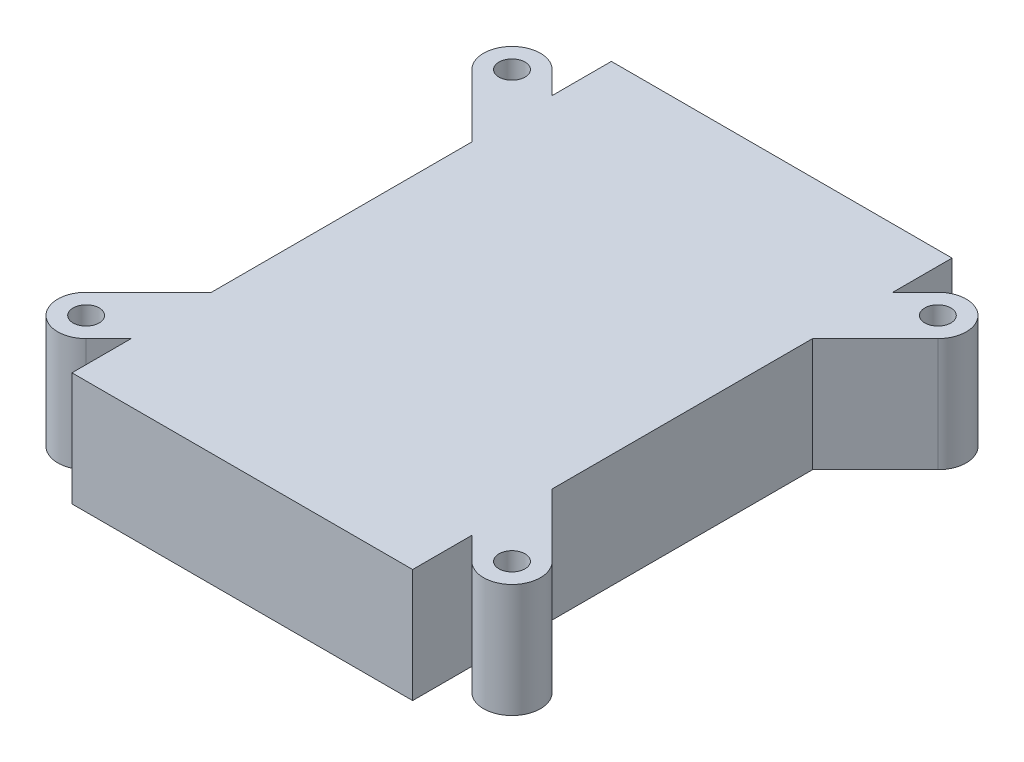
ISO-10303-21;
HEADER;
FILE_DESCRIPTION(('STEP AP214'),'2;1');
FILE_NAME('part.step','',(''),(''),'','','');
FILE_SCHEMA(('AUTOMOTIVE_DESIGN { 1 0 10303 214 1 1 1 1 }'));
ENDSEC;
DATA;
#1=APPLICATION_CONTEXT('core data for automotive mechanical design processes');
#2=APPLICATION_PROTOCOL_DEFINITION('international standard','automotive_design',2000,#1);
#3=PRODUCT_CONTEXT('',#1,'mechanical');
#4=PRODUCT('Part','Part','',(#3));
#5=PRODUCT_RELATED_PRODUCT_CATEGORY('part','',(#4));
#6=PRODUCT_DEFINITION_FORMATION('','',#4);
#7=PRODUCT_DEFINITION_CONTEXT('part definition',#1,'design');
#8=PRODUCT_DEFINITION('design','',#6,#7);
#9=PRODUCT_DEFINITION_SHAPE('','',#8);
#10=(LENGTH_UNIT() NAMED_UNIT(*) SI_UNIT(.MILLI.,.METRE.));
#11=(NAMED_UNIT(*) PLANE_ANGLE_UNIT() SI_UNIT($,.RADIAN.));
#12=(NAMED_UNIT(*) SI_UNIT($,.STERADIAN.) SOLID_ANGLE_UNIT());
#13=UNCERTAINTY_MEASURE_WITH_UNIT(LENGTH_MEASURE(1.E-05),#10,'distance_accuracy_value','');
#14=(GEOMETRIC_REPRESENTATION_CONTEXT(3) GLOBAL_UNCERTAINTY_ASSIGNED_CONTEXT((#13)) GLOBAL_UNIT_ASSIGNED_CONTEXT((#10,
#11,#12)) REPRESENTATION_CONTEXT('',''));
#15=CARTESIAN_POINT('',(0.,0.,0.));
#16=DIRECTION('',(0.,0.,1.));
#17=DIRECTION('',(1.,0.,0.));
#18=AXIS2_PLACEMENT_3D('',#15,#16,#17);
#19=CARTESIAN_POINT('',(37.5,20.,37.5));
#20=DIRECTION('',(0.,-1.,0.));
#21=DIRECTION('',(0.,0.,-1.));
#22=AXIS2_PLACEMENT_3D('',#19,#20,#21);
#23=CYLINDRICAL_SURFACE('',#22,5.);
#24=CARTESIAN_POINT('',(37.5,0.,37.5));
#25=DIRECTION('',(0.,1.,0.));
#26=DIRECTION('',(0.,0.,1.));
#27=AXIS2_PLACEMENT_3D('',#24,#25,#26);
#28=CIRCLE('',#27,5.);
#29=CARTESIAN_POINT('',(33.9644660940673,0.,41.0355339059327));
#30=VERTEX_POINT('',#29);
#31=CARTESIAN_POINT('',(41.0355339059327,0.,33.9644660940673));
#32=VERTEX_POINT('',#31);
#33=EDGE_CURVE('E295',#30,#32,#28,.T.);
#34=ORIENTED_EDGE('',*,*,#33,.T.);
#35=DIRECTION('',(0.,-1.,0.));
#36=VECTOR('',#35,1.);
#37=CARTESIAN_POINT('',(41.0355339059327,20.,33.9644660940673));
#38=LINE('',#37,#36);
#39=CARTESIAN_POINT('',(41.0355339059327,20.,33.9644660940673));
#40=VERTEX_POINT('',#39);
#41=EDGE_CURVE('E11',#40,#32,#38,.T.);
#42=ORIENTED_EDGE('',*,*,#41,.F.);
#43=CARTESIAN_POINT('',(37.5,20.,37.5));
#44=DIRECTION('',(0.,1.,0.));
#45=DIRECTION('',(0.,0.,1.));
#46=AXIS2_PLACEMENT_3D('',#43,#44,#45);
#47=CIRCLE('',#46,5.);
#48=CARTESIAN_POINT('',(33.9644660940673,20.,41.0355339059327));
#49=VERTEX_POINT('',#48);
#50=EDGE_CURVE('E219',#49,#40,#47,.T.);
#51=ORIENTED_EDGE('',*,*,#50,.F.);
#52=DIRECTION('',(0.,-1.,0.));
#53=VECTOR('',#52,1.);
#54=CARTESIAN_POINT('',(33.9644660940673,20.,41.0355339059327));
#55=LINE('',#54,#53);
#56=EDGE_CURVE('E54',#49,#30,#55,.T.);
#57=ORIENTED_EDGE('',*,*,#56,.T.);
#58=EDGE_LOOP('',(#34,#42,#51,#57));
#59=FACE_BOUND('',#58,.T.);
#60=ADVANCED_FACE('F37',(#59),#23,.T.);
#61=CARTESIAN_POINT('',(3.53553390593279,20.,-3.53553390593278));
#62=DIRECTION('',(-0.707106781186548,0.,0.707106781186547));
#63=DIRECTION('',(0.707106781186547,0.,0.707106781186548));
#64=AXIS2_PLACEMENT_3D('',#61,#62,#63);
#65=PLANE('',#64);
#66=DIRECTION('',(-0.707106781186547,0.,-0.707106781186548));
#67=VECTOR('',#66,1.);
#68=CARTESIAN_POINT('',(3.53553390593279,0.,-3.53553390593278));
#69=LINE('',#68,#67);
#70=CARTESIAN_POINT('',(30.,0.,22.9289321881345));
#71=VERTEX_POINT('',#70);
#72=EDGE_CURVE('E286',#32,#71,#69,.T.);
#73=ORIENTED_EDGE('',*,*,#72,.T.);
#74=DIRECTION('',(0.,-1.,0.));
#75=VECTOR('',#74,1.);
#76=CARTESIAN_POINT('',(30.,20.,22.9289321881345));
#77=LINE('',#76,#75);
#78=CARTESIAN_POINT('',(30.,20.,22.9289321881345));
#79=VERTEX_POINT('',#78);
#80=EDGE_CURVE('E46',#79,#71,#77,.T.);
#81=ORIENTED_EDGE('',*,*,#80,.F.);
#82=DIRECTION('',(-0.707106781186547,0.,-0.707106781186548));
#83=VECTOR('',#82,1.);
#84=CARTESIAN_POINT('',(3.53553390593279,20.,-3.53553390593278));
#85=LINE('',#84,#83);
#86=EDGE_CURVE('E129',#40,#79,#85,.T.);
#87=ORIENTED_EDGE('',*,*,#86,.F.);
#88=ORIENTED_EDGE('',*,*,#41,.T.);
#89=EDGE_LOOP('',(#73,#81,#87,#88));
#90=FACE_BOUND('',#89,.T.);
#91=ADVANCED_FACE('F350',(#90),#65,.F.);
#92=CARTESIAN_POINT('',(30.,20.,0.));
#93=DIRECTION('',(-1.,0.,0.));
#94=DIRECTION('',(0.,0.,1.));
#95=AXIS2_PLACEMENT_3D('',#92,#93,#94);
#96=PLANE('',#95);
#97=DIRECTION('',(0.,0.,-1.));
#98=VECTOR('',#97,1.);
#99=CARTESIAN_POINT('',(30.,0.,0.));
#100=LINE('',#99,#98);
#101=CARTESIAN_POINT('',(30.,0.,-22.9289321881343));
#102=VERTEX_POINT('',#101);
#103=EDGE_CURVE('E281',#71,#102,#100,.T.);
#104=ORIENTED_EDGE('',*,*,#103,.T.);
#105=DIRECTION('',(0.,-1.,0.));
#106=VECTOR('',#105,1.);
#107=CARTESIAN_POINT('',(30.,20.,-22.9289321881343));
#108=LINE('',#107,#106);
#109=CARTESIAN_POINT('',(30.,20.,-22.9289321881343));
#110=VERTEX_POINT('',#109);
#111=EDGE_CURVE('E275',#110,#102,#108,.T.);
#112=ORIENTED_EDGE('',*,*,#111,.F.);
#113=DIRECTION('',(0.,0.,-1.));
#114=VECTOR('',#113,1.);
#115=CARTESIAN_POINT('',(30.,20.,0.));
#116=LINE('',#115,#114);
#117=EDGE_CURVE('E206',#79,#110,#116,.T.);
#118=ORIENTED_EDGE('',*,*,#117,.F.);
#119=ORIENTED_EDGE('',*,*,#80,.T.);
#120=EDGE_LOOP('',(#104,#112,#118,#119));
#121=FACE_BOUND('',#120,.T.);
#122=ADVANCED_FACE('F280',(#121),#96,.F.);
#123=CARTESIAN_POINT('',(3.53553390593307,20.,3.53553390593301));
#124=DIRECTION('',(0.707106781186553,0.,0.707106781186542));
#125=DIRECTION('',(0.707106781186542,0.,-0.707106781186553));
#126=AXIS2_PLACEMENT_3D('',#123,#124,#125);
#127=PLANE('',#126);
#128=DIRECTION('',(-0.707106781186542,0.,0.707106781186553));
#129=VECTOR('',#128,1.);
#130=CARTESIAN_POINT('',(3.53553390593307,0.,3.53553390593301));
#131=LINE('',#130,#129);
#132=CARTESIAN_POINT('',(41.0355339059328,0.,-33.9644660940673));
#133=VERTEX_POINT('',#132);
#134=EDGE_CURVE('E289',#133,#102,#131,.T.);
#135=ORIENTED_EDGE('',*,*,#134,.F.);
#136=DIRECTION('',(0.,-1.,0.));
#137=VECTOR('',#136,1.);
#138=CARTESIAN_POINT('',(41.0355339059328,20.,-33.9644660940673));
#139=LINE('',#138,#137);
#140=CARTESIAN_POINT('',(41.0355339059328,20.,-33.9644660940673));
#141=VERTEX_POINT('',#140);
#142=EDGE_CURVE('E273',#141,#133,#139,.T.);
#143=ORIENTED_EDGE('',*,*,#142,.F.);
#144=DIRECTION('',(-0.707106781186542,0.,0.707106781186553));
#145=VECTOR('',#144,1.);
#146=CARTESIAN_POINT('',(3.53553390593307,20.,3.53553390593301));
#147=LINE('',#146,#145);
#148=EDGE_CURVE('E213',#141,#110,#147,.T.);
#149=ORIENTED_EDGE('',*,*,#148,.T.);
#150=ORIENTED_EDGE('',*,*,#111,.T.);
#151=EDGE_LOOP('',(#135,#143,#149,#150));
#152=FACE_BOUND('',#151,.T.);
#153=ADVANCED_FACE('F356',(#152),#127,.T.);
#154=CARTESIAN_POINT('',(37.5,20.,-37.5));
#155=DIRECTION('',(0.,-1.,0.));
#156=DIRECTION('',(0.,0.,-1.));
#157=AXIS2_PLACEMENT_3D('',#154,#155,#156);
#158=CYLINDRICAL_SURFACE('',#157,5.);
#159=CARTESIAN_POINT('',(37.5,0.,-37.5));
#160=DIRECTION('',(0.,1.,0.));
#161=DIRECTION('',(0.,0.,1.));
#162=AXIS2_PLACEMENT_3D('',#159,#160,#161);
#163=CIRCLE('',#162,5.);
#164=CARTESIAN_POINT('',(33.9644660940673,0.,-41.0355339059327));
#165=VERTEX_POINT('',#164);
#166=EDGE_CURVE('E293',#133,#165,#163,.T.);
#167=ORIENTED_EDGE('',*,*,#166,.T.);
#168=DIRECTION('',(0.,-1.,0.));
#169=VECTOR('',#168,1.);
#170=CARTESIAN_POINT('',(33.9644660940673,20.,-41.0355339059327));
#171=LINE('',#170,#169);
#172=CARTESIAN_POINT('',(33.9644660940673,20.,-41.0355339059327));
#173=VERTEX_POINT('',#172);
#174=EDGE_CURVE('E270',#173,#165,#171,.T.);
#175=ORIENTED_EDGE('',*,*,#174,.F.);
#176=CARTESIAN_POINT('',(37.5,20.,-37.5));
#177=DIRECTION('',(0.,1.,0.));
#178=DIRECTION('',(0.,0.,1.));
#179=AXIS2_PLACEMENT_3D('',#176,#177,#178);
#180=CIRCLE('',#179,5.);
#181=EDGE_CURVE('E218',#141,#173,#180,.T.);
#182=ORIENTED_EDGE('',*,*,#181,.F.);
#183=ORIENTED_EDGE('',*,*,#142,.T.);
#184=EDGE_LOOP('',(#167,#175,#182,#183));
#185=FACE_BOUND('',#184,.T.);
#186=ADVANCED_FACE('F359',(#185),#158,.T.);
#187=CARTESIAN_POINT('',(-3.53553390593257,20.,-3.53553390593254));
#188=DIRECTION('',(0.707106781186551,0.,0.707106781186544));
#189=DIRECTION('',(0.707106781186544,0.,-0.707106781186551));
#190=AXIS2_PLACEMENT_3D('',#187,#188,#189);
#191=PLANE('',#190);
#192=DIRECTION('',(-0.707106781186544,0.,0.707106781186551));
#193=VECTOR('',#192,1.);
#194=CARTESIAN_POINT('',(-3.53553390593257,0.,-3.53553390593254));
#195=LINE('',#194,#193);
#196=CARTESIAN_POINT('',(30.,0.,-37.0710678118654));
#197=VERTEX_POINT('',#196);
#198=EDGE_CURVE('E299',#165,#197,#195,.T.);
#199=ORIENTED_EDGE('',*,*,#198,.T.);
#200=DIRECTION('',(0.,-1.,0.));
#201=VECTOR('',#200,1.);
#202=CARTESIAN_POINT('',(30.,20.,-37.0710678118654));
#203=LINE('',#202,#201);
#204=CARTESIAN_POINT('',(30.,20.,-37.0710678118654));
#205=VERTEX_POINT('',#204);
#206=EDGE_CURVE('E267',#205,#197,#203,.T.);
#207=ORIENTED_EDGE('',*,*,#206,.F.);
#208=DIRECTION('',(-0.707106781186544,0.,0.707106781186551));
#209=VECTOR('',#208,1.);
#210=CARTESIAN_POINT('',(-3.53553390593257,20.,-3.53553390593254));
#211=LINE('',#210,#209);
#212=EDGE_CURVE('E212',#173,#205,#211,.T.);
#213=ORIENTED_EDGE('',*,*,#212,.F.);
#214=ORIENTED_EDGE('',*,*,#174,.T.);
#215=EDGE_LOOP('',(#199,#207,#213,#214));
#216=FACE_BOUND('',#215,.T.);
#217=ADVANCED_FACE('F363',(#216),#191,.F.);
#218=CARTESIAN_POINT('',(30.,0.,-47.5));
#219=VERTEX_POINT('',#218);
#220=EDGE_CURVE('E292',#197,#219,#100,.T.);
#221=ORIENTED_EDGE('',*,*,#220,.T.);
#222=DIRECTION('',(0.,-1.,0.));
#223=VECTOR('',#222,1.);
#224=CARTESIAN_POINT('',(30.,20.,-47.5));
#225=LINE('',#224,#223);
#226=CARTESIAN_POINT('',(30.,20.,-47.5));
#227=VERTEX_POINT('',#226);
#228=EDGE_CURVE('E264',#227,#219,#225,.T.);
#229=ORIENTED_EDGE('',*,*,#228,.F.);
#230=EDGE_CURVE('E205',#205,#227,#116,.T.);
#231=ORIENTED_EDGE('',*,*,#230,.F.);
#232=ORIENTED_EDGE('',*,*,#206,.T.);
#233=EDGE_LOOP('',(#221,#229,#231,#232));
#234=FACE_BOUND('',#233,.T.);
#235=ADVANCED_FACE('F367',(#234),#96,.F.);
#236=CARTESIAN_POINT('',(0.,20.,-47.5));
#237=DIRECTION('',(0.,0.,1.));
#238=DIRECTION('',(1.,0.,0.));
#239=AXIS2_PLACEMENT_3D('',#236,#237,#238);
#240=PLANE('',#239);
#241=DIRECTION('',(-1.,0.,0.));
#242=VECTOR('',#241,1.);
#243=CARTESIAN_POINT('',(0.,0.,-47.5));
#244=LINE('',#243,#242);
#245=CARTESIAN_POINT('',(-30.,0.,-47.5));
#246=VERTEX_POINT('',#245);
#247=EDGE_CURVE('E298',#219,#246,#244,.T.);
#248=ORIENTED_EDGE('',*,*,#247,.T.);
#249=DIRECTION('',(0.,-1.,0.));
#250=VECTOR('',#249,1.);
#251=CARTESIAN_POINT('',(-30.,20.,-47.5));
#252=LINE('',#251,#250);
#253=CARTESIAN_POINT('',(-30.,20.,-47.5));
#254=VERTEX_POINT('',#253);
#255=EDGE_CURVE('E261',#254,#246,#252,.T.);
#256=ORIENTED_EDGE('',*,*,#255,.F.);
#257=DIRECTION('',(-1.,0.,0.));
#258=VECTOR('',#257,1.);
#259=CARTESIAN_POINT('',(0.,20.,-47.5));
#260=LINE('',#259,#258);
#261=EDGE_CURVE('E211',#227,#254,#260,.T.);
#262=ORIENTED_EDGE('',*,*,#261,.F.);
#263=ORIENTED_EDGE('',*,*,#228,.T.);
#264=EDGE_LOOP('',(#248,#256,#262,#263));
#265=FACE_BOUND('',#264,.T.);
#266=ADVANCED_FACE('F368',(#265),#240,.F.);
#267=CARTESIAN_POINT('',(-30.,20.,0.));
#268=DIRECTION('',(1.,0.,0.));
#269=DIRECTION('',(0.,0.,-1.));
#270=AXIS2_PLACEMENT_3D('',#267,#268,#269);
#271=PLANE('',#270);
#272=DIRECTION('',(0.,0.,1.));
#273=VECTOR('',#272,1.);
#274=CARTESIAN_POINT('',(-30.,0.,0.));
#275=LINE('',#274,#273);
#276=CARTESIAN_POINT('',(-30.,0.,-37.0710678118655));
#277=VERTEX_POINT('',#276);
#278=EDGE_CURVE('E303',#246,#277,#275,.T.);
#279=ORIENTED_EDGE('',*,*,#278,.T.);
#280=DIRECTION('',(0.,-1.,0.));
#281=VECTOR('',#280,1.);
#282=CARTESIAN_POINT('',(-30.,20.,-37.0710678118655));
#283=LINE('',#282,#281);
#284=CARTESIAN_POINT('',(-30.,20.,-37.0710678118655));
#285=VERTEX_POINT('',#284);
#286=EDGE_CURVE('E259',#285,#277,#283,.T.);
#287=ORIENTED_EDGE('',*,*,#286,.F.);
#288=DIRECTION('',(0.,0.,1.));
#289=VECTOR('',#288,1.);
#290=CARTESIAN_POINT('',(-30.,20.,0.));
#291=LINE('',#290,#289);
#292=EDGE_CURVE('E588',#254,#285,#291,.T.);
#293=ORIENTED_EDGE('',*,*,#292,.F.);
#294=ORIENTED_EDGE('',*,*,#255,.T.);
#295=EDGE_LOOP('',(#279,#287,#293,#294));
#296=FACE_BOUND('',#295,.T.);
#297=ADVANCED_FACE('F371',(#296),#271,.F.);
#298=CARTESIAN_POINT('',(3.53553390593277,20.,-3.53553390593277));
#299=DIRECTION('',(0.707106781186547,0.,-0.707106781186548));
#300=DIRECTION('',(-0.707106781186548,0.,-0.707106781186547));
#301=AXIS2_PLACEMENT_3D('',#298,#299,#300);
#302=PLANE('',#301);
#303=DIRECTION('',(0.707106781186548,0.,0.707106781186547));
#304=VECTOR('',#303,1.);
#305=CARTESIAN_POINT('',(3.53553390593277,0.,-3.53553390593277));
#306=LINE('',#305,#304);
#307=CARTESIAN_POINT('',(-33.9644660940673,0.,-41.0355339059327));
#308=VERTEX_POINT('',#307);
#309=EDGE_CURVE('E313',#308,#277,#306,.T.);
#310=ORIENTED_EDGE('',*,*,#309,.F.);
#311=DIRECTION('',(0.,-1.,0.));
#312=VECTOR('',#311,1.);
#313=CARTESIAN_POINT('',(-33.9644660940673,20.,-41.0355339059327));
#314=LINE('',#313,#312);
#315=CARTESIAN_POINT('',(-33.9644660940673,20.,-41.0355339059327));
#316=VERTEX_POINT('',#315);
#317=EDGE_CURVE('E257',#316,#308,#314,.T.);
#318=ORIENTED_EDGE('',*,*,#317,.F.);
#319=DIRECTION('',(0.707106781186548,0.,0.707106781186547));
#320=VECTOR('',#319,1.);
#321=CARTESIAN_POINT('',(3.53553390593277,20.,-3.53553390593277));
#322=LINE('',#321,#320);
#323=EDGE_CURVE('E585',#316,#285,#322,.T.);
#324=ORIENTED_EDGE('',*,*,#323,.T.);
#325=ORIENTED_EDGE('',*,*,#286,.T.);
#326=EDGE_LOOP('',(#310,#318,#324,#325));
#327=FACE_BOUND('',#326,.T.);
#328=ADVANCED_FACE('F373',(#327),#302,.T.);
#329=CARTESIAN_POINT('',(-37.5,20.,-37.5));
#330=DIRECTION('',(0.,-1.,0.));
#331=DIRECTION('',(0.,0.,-1.));
#332=AXIS2_PLACEMENT_3D('',#329,#330,#331);
#333=CYLINDRICAL_SURFACE('',#332,5.);
#334=CARTESIAN_POINT('',(-37.5,0.,-37.5));
#335=DIRECTION('',(0.,1.,0.));
#336=DIRECTION('',(0.,0.,1.));
#337=AXIS2_PLACEMENT_3D('',#334,#335,#336);
#338=CIRCLE('',#337,5.);
#339=CARTESIAN_POINT('',(-41.0355339059327,0.,-33.9644660940672));
#340=VERTEX_POINT('',#339);
#341=EDGE_CURVE('E318',#308,#340,#338,.T.);
#342=ORIENTED_EDGE('',*,*,#341,.T.);
#343=DIRECTION('',(0.,-1.,0.));
#344=VECTOR('',#343,1.);
#345=CARTESIAN_POINT('',(-41.0355339059327,20.,-33.9644660940672));
#346=LINE('',#345,#344);
#347=CARTESIAN_POINT('',(-41.0355339059327,20.,-33.9644660940672));
#348=VERTEX_POINT('',#347);
#349=EDGE_CURVE('E254',#348,#340,#346,.T.);
#350=ORIENTED_EDGE('',*,*,#349,.F.);
#351=CARTESIAN_POINT('',(-37.5,20.,-37.5));
#352=DIRECTION('',(0.,1.,0.));
#353=DIRECTION('',(0.,0.,1.));
#354=AXIS2_PLACEMENT_3D('',#351,#352,#353);
#355=CIRCLE('',#354,5.);
#356=EDGE_CURVE('E583',#316,#348,#355,.T.);
#357=ORIENTED_EDGE('',*,*,#356,.F.);
#358=ORIENTED_EDGE('',*,*,#317,.T.);
#359=EDGE_LOOP('',(#342,#350,#357,#358));
#360=FACE_BOUND('',#359,.T.);
#361=ADVANCED_FACE('F376',(#360),#333,.T.);
#362=CARTESIAN_POINT('',(-3.53553390593229,20.,3.53553390593237));
#363=DIRECTION('',(0.70710678118654,0.,-0.707106781186555));
#364=DIRECTION('',(-0.707106781186555,0.,-0.70710678118654));
#365=AXIS2_PLACEMENT_3D('',#362,#363,#364);
#366=PLANE('',#365);
#367=DIRECTION('',(0.707106781186555,0.,0.70710678118654));
#368=VECTOR('',#367,1.);
#369=CARTESIAN_POINT('',(-3.53553390593229,0.,3.53553390593237));
#370=LINE('',#369,#368);
#371=CARTESIAN_POINT('',(-30.,0.,-22.9289321881348));
#372=VERTEX_POINT('',#371);
#373=EDGE_CURVE('E320',#340,#372,#370,.T.);
#374=ORIENTED_EDGE('',*,*,#373,.T.);
#375=DIRECTION('',(0.,-1.,0.));
#376=VECTOR('',#375,1.);
#377=CARTESIAN_POINT('',(-30.,20.,-22.9289321881348));
#378=LINE('',#377,#376);
#379=CARTESIAN_POINT('',(-30.,20.,-22.9289321881348));
#380=VERTEX_POINT('',#379);
#381=EDGE_CURVE('E251',#380,#372,#378,.T.);
#382=ORIENTED_EDGE('',*,*,#381,.F.);
#383=DIRECTION('',(0.707106781186555,0.,0.70710678118654));
#384=VECTOR('',#383,1.);
#385=CARTESIAN_POINT('',(-3.53553390593229,20.,3.53553390593237));
#386=LINE('',#385,#384);
#387=EDGE_CURVE('E581',#348,#380,#386,.T.);
#388=ORIENTED_EDGE('',*,*,#387,.F.);
#389=ORIENTED_EDGE('',*,*,#349,.T.);
#390=EDGE_LOOP('',(#374,#382,#388,#389));
#391=FACE_BOUND('',#390,.T.);
#392=ADVANCED_FACE('F380',(#391),#366,.F.);
#393=CARTESIAN_POINT('',(-30.,0.,22.9289321881344));
#394=VERTEX_POINT('',#393);
#395=EDGE_CURVE('E315',#372,#394,#275,.T.);
#396=ORIENTED_EDGE('',*,*,#395,.T.);
#397=DIRECTION('',(0.,-1.,0.));
#398=VECTOR('',#397,1.);
#399=CARTESIAN_POINT('',(-30.,20.,22.9289321881344));
#400=LINE('',#399,#398);
#401=CARTESIAN_POINT('',(-30.,20.,22.9289321881344));
#402=VERTEX_POINT('',#401);
#403=EDGE_CURVE('E249',#402,#394,#400,.T.);
#404=ORIENTED_EDGE('',*,*,#403,.F.);
#405=EDGE_CURVE('E580',#380,#402,#291,.T.);
#406=ORIENTED_EDGE('',*,*,#405,.F.);
#407=ORIENTED_EDGE('',*,*,#381,.T.);
#408=EDGE_LOOP('',(#396,#404,#406,#407));
#409=FACE_BOUND('',#408,.T.);
#410=ADVANCED_FACE('F384',(#409),#271,.F.);
#411=CARTESIAN_POINT('',(-3.53553390593295,20.,-3.53553390593291));
#412=DIRECTION('',(-0.707106781186551,0.,-0.707106781186544));
#413=DIRECTION('',(-0.707106781186544,0.,0.707106781186551));
#414=AXIS2_PLACEMENT_3D('',#411,#412,#413);
#415=PLANE('',#414);
#416=DIRECTION('',(0.707106781186544,0.,-0.707106781186551));
#417=VECTOR('',#416,1.);
#418=CARTESIAN_POINT('',(-3.53553390593295,0.,-3.53553390593291));
#419=LINE('',#418,#417);
#420=CARTESIAN_POINT('',(-41.0355339059328,0.,33.9644660940673));
#421=VERTEX_POINT('',#420);
#422=EDGE_CURVE('E322',#421,#394,#419,.T.);
#423=ORIENTED_EDGE('',*,*,#422,.F.);
#424=DIRECTION('',(0.,-1.,0.));
#425=VECTOR('',#424,1.);
#426=CARTESIAN_POINT('',(-41.0355339059328,20.,33.9644660940673));
#427=LINE('',#426,#425);
#428=CARTESIAN_POINT('',(-41.0355339059328,20.,33.9644660940673));
#429=VERTEX_POINT('',#428);
#430=EDGE_CURVE('E247',#429,#421,#427,.T.);
#431=ORIENTED_EDGE('',*,*,#430,.F.);
#432=DIRECTION('',(0.707106781186544,0.,-0.707106781186551));
#433=VECTOR('',#432,1.);
#434=CARTESIAN_POINT('',(-3.53553390593295,20.,-3.53553390593291));
#435=LINE('',#434,#433);
#436=EDGE_CURVE('E577',#429,#402,#435,.T.);
#437=ORIENTED_EDGE('',*,*,#436,.T.);
#438=ORIENTED_EDGE('',*,*,#403,.T.);
#439=EDGE_LOOP('',(#423,#431,#437,#438));
#440=FACE_BOUND('',#439,.T.);
#441=ADVANCED_FACE('F386',(#440),#415,.T.);
#442=CARTESIAN_POINT('',(-37.5,20.,37.5));
#443=DIRECTION('',(0.,-1.,0.));
#444=DIRECTION('',(0.,0.,-1.));
#445=AXIS2_PLACEMENT_3D('',#442,#443,#444);
#446=CYLINDRICAL_SURFACE('',#445,5.);
#447=CARTESIAN_POINT('',(-37.5,0.,37.5));
#448=DIRECTION('',(0.,1.,0.));
#449=DIRECTION('',(0.,0.,1.));
#450=AXIS2_PLACEMENT_3D('',#447,#448,#449);
#451=CIRCLE('',#450,5.);
#452=CARTESIAN_POINT('',(-33.9644660940673,0.,41.0355339059328));
#453=VERTEX_POINT('',#452);
#454=EDGE_CURVE('E325',#421,#453,#451,.T.);
#455=ORIENTED_EDGE('',*,*,#454,.T.);
#456=DIRECTION('',(0.,-1.,0.));
#457=VECTOR('',#456,1.);
#458=CARTESIAN_POINT('',(-33.9644660940673,20.,41.0355339059328));
#459=LINE('',#458,#457);
#460=CARTESIAN_POINT('',(-33.9644660940673,20.,41.0355339059328));
#461=VERTEX_POINT('',#460);
#462=EDGE_CURVE('E244',#461,#453,#459,.T.);
#463=ORIENTED_EDGE('',*,*,#462,.F.);
#464=CARTESIAN_POINT('',(-37.5,20.,37.5));
#465=DIRECTION('',(0.,1.,0.));
#466=DIRECTION('',(0.,0.,1.));
#467=AXIS2_PLACEMENT_3D('',#464,#465,#466);
#468=CIRCLE('',#467,5.);
#469=EDGE_CURVE('E575',#429,#461,#468,.T.);
#470=ORIENTED_EDGE('',*,*,#469,.F.);
#471=ORIENTED_EDGE('',*,*,#430,.T.);
#472=EDGE_LOOP('',(#455,#463,#470,#471));
#473=FACE_BOUND('',#472,.T.);
#474=ADVANCED_FACE('F389',(#473),#446,.T.);
#475=CARTESIAN_POINT('',(3.53553390593279,20.,3.5355339059328));
#476=DIRECTION('',(-0.707106781186547,0.,-0.707106781186548));
#477=DIRECTION('',(-0.707106781186548,0.,0.707106781186547));
#478=AXIS2_PLACEMENT_3D('',#475,#476,#477);
#479=PLANE('',#478);
#480=DIRECTION('',(0.707106781186548,0.,-0.707106781186547));
#481=VECTOR('',#480,1.);
#482=CARTESIAN_POINT('',(3.53553390593279,0.,3.5355339059328));
#483=LINE('',#482,#481);
#484=CARTESIAN_POINT('',(-30.,0.,37.0710678118655));
#485=VERTEX_POINT('',#484);
#486=EDGE_CURVE('E327',#453,#485,#483,.T.);
#487=ORIENTED_EDGE('',*,*,#486,.T.);
#488=DIRECTION('',(0.,-1.,0.));
#489=VECTOR('',#488,1.);
#490=CARTESIAN_POINT('',(-30.,20.,37.0710678118655));
#491=LINE('',#490,#489);
#492=CARTESIAN_POINT('',(-30.,20.,37.0710678118655));
#493=VERTEX_POINT('',#492);
#494=EDGE_CURVE('E241',#493,#485,#491,.T.);
#495=ORIENTED_EDGE('',*,*,#494,.F.);
#496=DIRECTION('',(0.707106781186548,0.,-0.707106781186547));
#497=VECTOR('',#496,1.);
#498=CARTESIAN_POINT('',(3.53553390593279,20.,3.5355339059328));
#499=LINE('',#498,#497);
#500=EDGE_CURVE('E573',#461,#493,#499,.T.);
#501=ORIENTED_EDGE('',*,*,#500,.F.);
#502=ORIENTED_EDGE('',*,*,#462,.T.);
#503=EDGE_LOOP('',(#487,#495,#501,#502));
#504=FACE_BOUND('',#503,.T.);
#505=ADVANCED_FACE('F393',(#504),#479,.F.);
#506=CARTESIAN_POINT('',(-30.,0.,47.5));
#507=VERTEX_POINT('',#506);
#508=EDGE_CURVE('E314',#485,#507,#275,.T.);
#509=ORIENTED_EDGE('',*,*,#508,.T.);
#510=DIRECTION('',(0.,-1.,0.));
#511=VECTOR('',#510,1.);
#512=CARTESIAN_POINT('',(-30.,20.,47.5));
#513=LINE('',#512,#511);
#514=CARTESIAN_POINT('',(-30.,20.,47.5));
#515=VERTEX_POINT('',#514);
#516=EDGE_CURVE('E200',#515,#507,#513,.T.);
#517=ORIENTED_EDGE('',*,*,#516,.F.);
#518=EDGE_CURVE('E188',#493,#515,#291,.T.);
#519=ORIENTED_EDGE('',*,*,#518,.F.);
#520=ORIENTED_EDGE('',*,*,#494,.T.);
#521=EDGE_LOOP('',(#509,#517,#519,#520));
#522=FACE_BOUND('',#521,.T.);
#523=ADVANCED_FACE('F397',(#522),#271,.F.);
#524=CARTESIAN_POINT('',(0.,20.,47.5));
#525=DIRECTION('',(0.,0.,-1.));
#526=DIRECTION('',(-1.,0.,0.));
#527=AXIS2_PLACEMENT_3D('',#524,#525,#526);
#528=PLANE('',#527);
#529=DIRECTION('',(1.,0.,0.));
#530=VECTOR('',#529,1.);
#531=CARTESIAN_POINT('',(0.,0.,47.5));
#532=LINE('',#531,#530);
#533=CARTESIAN_POINT('',(30.,0.,47.5));
#534=VERTEX_POINT('',#533);
#535=EDGE_CURVE('E197',#507,#534,#532,.T.);
#536=ORIENTED_EDGE('',*,*,#535,.T.);
#537=DIRECTION('',(0.,-1.,0.));
#538=VECTOR('',#537,1.);
#539=CARTESIAN_POINT('',(30.,20.,47.5));
#540=LINE('',#539,#538);
#541=CARTESIAN_POINT('',(30.,20.,47.5));
#542=VERTEX_POINT('',#541);
#543=EDGE_CURVE('E194',#542,#534,#540,.T.);
#544=ORIENTED_EDGE('',*,*,#543,.F.);
#545=DIRECTION('',(1.,0.,0.));
#546=VECTOR('',#545,1.);
#547=CARTESIAN_POINT('',(0.,20.,47.5));
#548=LINE('',#547,#546);
#549=EDGE_CURVE('E180',#515,#542,#548,.T.);
#550=ORIENTED_EDGE('',*,*,#549,.F.);
#551=ORIENTED_EDGE('',*,*,#516,.T.);
#552=EDGE_LOOP('',(#536,#544,#550,#551));
#553=FACE_BOUND('',#552,.T.);
#554=ADVANCED_FACE('F195',(#553),#528,.F.);
#555=CARTESIAN_POINT('',(30.,0.,37.0710678118655));
#556=VERTEX_POINT('',#555);
#557=EDGE_CURVE('E291',#534,#556,#100,.T.);
#558=ORIENTED_EDGE('',*,*,#557,.T.);
#559=DIRECTION('',(0.,-1.,0.));
#560=VECTOR('',#559,1.);
#561=CARTESIAN_POINT('',(30.,20.,37.0710678118655));
#562=LINE('',#561,#560);
#563=CARTESIAN_POINT('',(30.,20.,37.0710678118655));
#564=VERTEX_POINT('',#563);
#565=EDGE_CURVE('E117',#564,#556,#562,.T.);
#566=ORIENTED_EDGE('',*,*,#565,.F.);
#567=EDGE_CURVE('E186',#542,#564,#116,.T.);
#568=ORIENTED_EDGE('',*,*,#567,.F.);
#569=ORIENTED_EDGE('',*,*,#543,.T.);
#570=EDGE_LOOP('',(#558,#566,#568,#569));
#571=FACE_BOUND('',#570,.T.);
#572=ADVANCED_FACE('F202',(#571),#96,.F.);
#573=CARTESIAN_POINT('',(-37.5,20.,-37.5));
#574=DIRECTION('',(0.,-1.,0.));
#575=DIRECTION('',(0.,0.,-1.));
#576=AXIS2_PLACEMENT_3D('',#573,#574,#575);
#577=CYLINDRICAL_SURFACE('',#576,2.30000000000001);
#578=CARTESIAN_POINT('',(-37.5,20.,-37.5));
#579=DIRECTION('',(0.,1.,0.));
#580=DIRECTION('',(0.,0.,1.));
#581=AXIS2_PLACEMENT_3D('',#578,#579,#580);
#582=CIRCLE('',#581,2.30000000000001);
#583=CARTESIAN_POINT('',(-37.5,20.,-35.2));
#584=VERTEX_POINT('',#583);
#585=EDGE_CURVE('E569',#584,#584,#582,.T.);
#586=ORIENTED_EDGE('',*,*,#585,.T.);
#587=EDGE_LOOP('',(#586));
#588=FACE_BOUND('',#587,.T.);
#589=CARTESIAN_POINT('',(-37.5,0.,-37.5));
#590=DIRECTION('',(0.,1.,0.));
#591=DIRECTION('',(0.,0.,1.));
#592=AXIS2_PLACEMENT_3D('',#589,#590,#591);
#593=CIRCLE('',#592,2.30000000000001);
#594=CARTESIAN_POINT('',(-37.5,0.,-35.2));
#595=VERTEX_POINT('',#594);
#596=EDGE_CURVE('E228',#595,#595,#593,.T.);
#597=ORIENTED_EDGE('',*,*,#596,.F.);
#598=EDGE_LOOP('',(#597));
#599=FACE_BOUND('',#598,.T.);
#600=ADVANCED_FACE('F338',(#588,#599),#577,.F.);
#601=CARTESIAN_POINT('',(37.5,20.,37.5));
#602=DIRECTION('',(0.,-1.,0.));
#603=DIRECTION('',(0.,0.,-1.));
#604=AXIS2_PLACEMENT_3D('',#601,#602,#603);
#605=CYLINDRICAL_SURFACE('',#604,2.30000000000001);
#606=CARTESIAN_POINT('',(37.5,20.,37.5));
#607=DIRECTION('',(0.,1.,0.));
#608=DIRECTION('',(0.,0.,1.));
#609=AXIS2_PLACEMENT_3D('',#606,#607,#608);
#610=CIRCLE('',#609,2.30000000000001);
#611=CARTESIAN_POINT('',(37.5,20.,39.8));
#612=VERTEX_POINT('',#611);
#613=EDGE_CURVE('E207',#612,#612,#610,.T.);
#614=ORIENTED_EDGE('',*,*,#613,.T.);
#615=EDGE_LOOP('',(#614));
#616=FACE_BOUND('',#615,.T.);
#617=CARTESIAN_POINT('',(37.5,0.,37.5));
#618=DIRECTION('',(0.,1.,0.));
#619=DIRECTION('',(0.,0.,1.));
#620=AXIS2_PLACEMENT_3D('',#617,#618,#619);
#621=CIRCLE('',#620,2.30000000000001);
#622=CARTESIAN_POINT('',(37.5,0.,39.8));
#623=VERTEX_POINT('',#622);
#624=EDGE_CURVE('E233',#623,#623,#621,.T.);
#625=ORIENTED_EDGE('',*,*,#624,.F.);
#626=EDGE_LOOP('',(#625));
#627=FACE_BOUND('',#626,.T.);
#628=ADVANCED_FACE('F335',(#616,#627),#605,.F.);
#629=CARTESIAN_POINT('',(-3.53553390593269,20.,3.53553390593268));
#630=DIRECTION('',(-0.707106781186549,0.,0.707106781186547));
#631=DIRECTION('',(0.707106781186547,0.,0.707106781186549));
#632=AXIS2_PLACEMENT_3D('',#629,#630,#631);
#633=PLANE('',#632);
#634=DIRECTION('',(-0.707106781186547,0.,-0.707106781186549));
#635=VECTOR('',#634,1.);
#636=CARTESIAN_POINT('',(-3.53553390593269,0.,3.53553390593268));
#637=LINE('',#636,#635);
#638=EDGE_CURVE('E297',#30,#556,#637,.T.);
#639=ORIENTED_EDGE('',*,*,#638,.F.);
#640=ORIENTED_EDGE('',*,*,#56,.F.);
#641=DIRECTION('',(-0.707106781186547,0.,-0.707106781186549));
#642=VECTOR('',#641,1.);
#643=CARTESIAN_POINT('',(-3.53553390593269,20.,3.53553390593268));
#644=LINE('',#643,#642);
#645=EDGE_CURVE('E203',#49,#564,#644,.T.);
#646=ORIENTED_EDGE('',*,*,#645,.T.);
#647=ORIENTED_EDGE('',*,*,#565,.T.);
#648=EDGE_LOOP('',(#639,#640,#646,#647));
#649=FACE_BOUND('',#648,.T.);
#650=ADVANCED_FACE('F337',(#649),#633,.T.);
#651=CARTESIAN_POINT('',(37.5,20.,-37.5));
#652=DIRECTION('',(0.,-1.,0.));
#653=DIRECTION('',(0.,0.,-1.));
#654=AXIS2_PLACEMENT_3D('',#651,#652,#653);
#655=CYLINDRICAL_SURFACE('',#654,2.30000000000001);
#656=CARTESIAN_POINT('',(37.5,20.,-37.5));
#657=DIRECTION('',(0.,1.,0.));
#658=DIRECTION('',(0.,0.,1.));
#659=AXIS2_PLACEMENT_3D('',#656,#657,#658);
#660=CIRCLE('',#659,2.30000000000001);
#661=CARTESIAN_POINT('',(37.5,20.,-35.2));
#662=VERTEX_POINT('',#661);
#663=EDGE_CURVE('E220',#662,#662,#660,.T.);
#664=ORIENTED_EDGE('',*,*,#663,.T.);
#665=EDGE_LOOP('',(#664));
#666=FACE_BOUND('',#665,.T.);
#667=CARTESIAN_POINT('',(37.5,0.,-37.5));
#668=DIRECTION('',(0.,1.,0.));
#669=DIRECTION('',(0.,0.,1.));
#670=AXIS2_PLACEMENT_3D('',#667,#668,#669);
#671=CIRCLE('',#670,2.30000000000001);
#672=CARTESIAN_POINT('',(37.5,0.,-35.2));
#673=VERTEX_POINT('',#672);
#674=EDGE_CURVE('E562',#673,#673,#671,.T.);
#675=ORIENTED_EDGE('',*,*,#674,.F.);
#676=EDGE_LOOP('',(#675));
#677=FACE_BOUND('',#676,.T.);
#678=ADVANCED_FACE('F39',(#666,#677),#655,.F.);
#679=CARTESIAN_POINT('',(-37.5,20.,37.5));
#680=DIRECTION('',(0.,-1.,0.));
#681=DIRECTION('',(0.,0.,-1.));
#682=AXIS2_PLACEMENT_3D('',#679,#680,#681);
#683=CYLINDRICAL_SURFACE('',#682,2.3);
#684=CARTESIAN_POINT('',(-37.5,20.,37.5));
#685=DIRECTION('',(0.,1.,0.));
#686=DIRECTION('',(0.,0.,1.));
#687=AXIS2_PLACEMENT_3D('',#684,#685,#686);
#688=CIRCLE('',#687,2.3);
#689=CARTESIAN_POINT('',(-37.5,20.,39.8));
#690=VERTEX_POINT('',#689);
#691=EDGE_CURVE('E238',#690,#690,#688,.T.);
#692=ORIENTED_EDGE('',*,*,#691,.T.);
#693=EDGE_LOOP('',(#692));
#694=FACE_BOUND('',#693,.T.);
#695=CARTESIAN_POINT('',(-37.5,0.,37.5));
#696=DIRECTION('',(0.,1.,0.));
#697=DIRECTION('',(0.,0.,1.));
#698=AXIS2_PLACEMENT_3D('',#695,#696,#697);
#699=CIRCLE('',#698,2.3);
#700=CARTESIAN_POINT('',(-37.5,0.,39.8));
#701=VERTEX_POINT('',#700);
#702=EDGE_CURVE('E224',#701,#701,#699,.T.);
#703=ORIENTED_EDGE('',*,*,#702,.F.);
#704=EDGE_LOOP('',(#703));
#705=FACE_BOUND('',#704,.T.);
#706=ADVANCED_FACE('F492',(#694,#705),#683,.F.);
#707=CARTESIAN_POINT('',(0.,20.,0.));
#708=DIRECTION('',(0.,1.,0.));
#709=DIRECTION('',(0.,0.,1.));
#710=AXIS2_PLACEMENT_3D('',#707,#708,#709);
#711=PLANE('',#710);
#712=ORIENTED_EDGE('',*,*,#663,.F.);
#713=EDGE_LOOP('',(#712));
#714=FACE_BOUND('',#713,.T.);
#715=ORIENTED_EDGE('',*,*,#50,.T.);
#716=ORIENTED_EDGE('',*,*,#86,.T.);
#717=ORIENTED_EDGE('',*,*,#117,.T.);
#718=ORIENTED_EDGE('',*,*,#148,.F.);
#719=ORIENTED_EDGE('',*,*,#181,.T.);
#720=ORIENTED_EDGE('',*,*,#212,.T.);
#721=ORIENTED_EDGE('',*,*,#230,.T.);
#722=ORIENTED_EDGE('',*,*,#261,.T.);
#723=ORIENTED_EDGE('',*,*,#292,.T.);
#724=ORIENTED_EDGE('',*,*,#323,.F.);
#725=ORIENTED_EDGE('',*,*,#356,.T.);
#726=ORIENTED_EDGE('',*,*,#387,.T.);
#727=ORIENTED_EDGE('',*,*,#405,.T.);
#728=ORIENTED_EDGE('',*,*,#436,.F.);
#729=ORIENTED_EDGE('',*,*,#469,.T.);
#730=ORIENTED_EDGE('',*,*,#500,.T.);
#731=ORIENTED_EDGE('',*,*,#518,.T.);
#732=ORIENTED_EDGE('',*,*,#549,.T.);
#733=ORIENTED_EDGE('',*,*,#567,.T.);
#734=ORIENTED_EDGE('',*,*,#645,.F.);
#735=EDGE_LOOP('',(#715,#716,#717,#718,#719,#720,#721,#722,#723,#724,#725,#726,#727,#728,#729,
#730,#731,#732,#733,#734));
#736=FACE_BOUND('',#735,.T.);
#737=ORIENTED_EDGE('',*,*,#613,.F.);
#738=EDGE_LOOP('',(#737));
#739=FACE_BOUND('',#738,.T.);
#740=ORIENTED_EDGE('',*,*,#585,.F.);
#741=EDGE_LOOP('',(#740));
#742=FACE_BOUND('',#741,.T.);
#743=ORIENTED_EDGE('',*,*,#691,.F.);
#744=EDGE_LOOP('',(#743));
#745=FACE_BOUND('',#744,.T.);
#746=ADVANCED_FACE('F182',(#714,#736,#739,#742,#745),#711,.T.);
#747=CARTESIAN_POINT('',(0.,0.,0.));
#748=DIRECTION('',(0.,1.,0.));
#749=DIRECTION('',(0.,0.,1.));
#750=AXIS2_PLACEMENT_3D('',#747,#748,#749);
#751=PLANE('',#750);
#752=ORIENTED_EDGE('',*,*,#674,.T.);
#753=EDGE_LOOP('',(#752));
#754=FACE_BOUND('',#753,.T.);
#755=ORIENTED_EDGE('',*,*,#33,.F.);
#756=ORIENTED_EDGE('',*,*,#638,.T.);
#757=ORIENTED_EDGE('',*,*,#557,.F.);
#758=ORIENTED_EDGE('',*,*,#535,.F.);
#759=ORIENTED_EDGE('',*,*,#508,.F.);
#760=ORIENTED_EDGE('',*,*,#486,.F.);
#761=ORIENTED_EDGE('',*,*,#454,.F.);
#762=ORIENTED_EDGE('',*,*,#422,.T.);
#763=ORIENTED_EDGE('',*,*,#395,.F.);
#764=ORIENTED_EDGE('',*,*,#373,.F.);
#765=ORIENTED_EDGE('',*,*,#341,.F.);
#766=ORIENTED_EDGE('',*,*,#309,.T.);
#767=ORIENTED_EDGE('',*,*,#278,.F.);
#768=ORIENTED_EDGE('',*,*,#247,.F.);
#769=ORIENTED_EDGE('',*,*,#220,.F.);
#770=ORIENTED_EDGE('',*,*,#198,.F.);
#771=ORIENTED_EDGE('',*,*,#166,.F.);
#772=ORIENTED_EDGE('',*,*,#134,.T.);
#773=ORIENTED_EDGE('',*,*,#103,.F.);
#774=ORIENTED_EDGE('',*,*,#72,.F.);
#775=EDGE_LOOP('',(#755,#756,#757,#758,#759,#760,#761,#762,#763,#764,#765,#766,#767,#768,#769,
#770,#771,#772,#773,#774));
#776=FACE_BOUND('',#775,.T.);
#777=ORIENTED_EDGE('',*,*,#624,.T.);
#778=EDGE_LOOP('',(#777));
#779=FACE_BOUND('',#778,.T.);
#780=ORIENTED_EDGE('',*,*,#596,.T.);
#781=EDGE_LOOP('',(#780));
#782=FACE_BOUND('',#781,.T.);
#783=ORIENTED_EDGE('',*,*,#702,.T.);
#784=EDGE_LOOP('',(#783));
#785=FACE_BOUND('',#784,.T.);
#786=ADVANCED_FACE('F284',(#754,#776,#779,#782,#785),#751,.F.);
#787=CLOSED_SHELL('',(#60,#91,#122,#153,#186,#217,#235,#266,#297,#328,#361,#392,#410,#441,#474,
#505,#523,#554,#572,#600,#628,#650,#678,#706,#746,#786));
#788=MANIFOLD_SOLID_BREP('B2',#787);
#789=ADVANCED_BREP_SHAPE_REPRESENTATION('',(#18,#788),#14);
#790=SHAPE_DEFINITION_REPRESENTATION(#9,#789);
ENDSEC;
END-ISO-10303-21;
